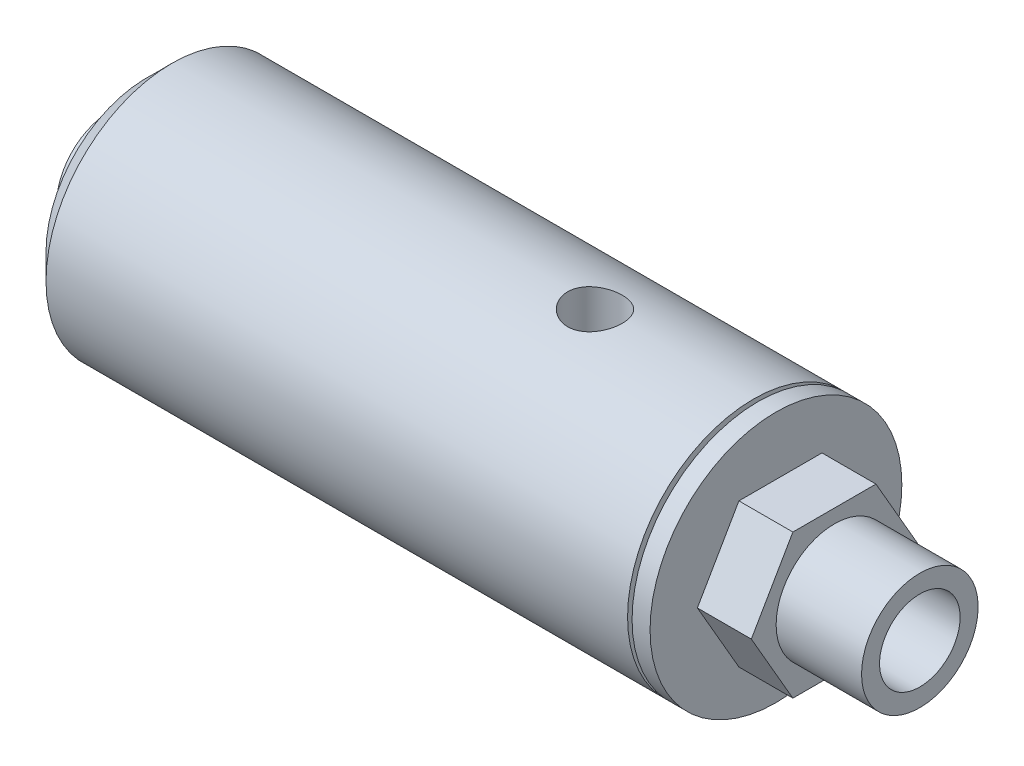
ISO-10303-21;
HEADER;
FILE_DESCRIPTION(('STEP AP214'),'2;1');
FILE_NAME('part.step','',(''),(''),'','','');
FILE_SCHEMA(('AUTOMOTIVE_DESIGN { 1 0 10303 214 1 1 1 1 }'));
ENDSEC;
DATA;
#1=APPLICATION_CONTEXT('core data for automotive mechanical design processes');
#2=APPLICATION_PROTOCOL_DEFINITION('international standard','automotive_design',2000,#1);
#3=PRODUCT_CONTEXT('',#1,'mechanical');
#4=PRODUCT('Part','Part','',(#3));
#5=PRODUCT_RELATED_PRODUCT_CATEGORY('part','',(#4));
#6=PRODUCT_DEFINITION_FORMATION('','',#4);
#7=PRODUCT_DEFINITION_CONTEXT('part definition',#1,'design');
#8=PRODUCT_DEFINITION('design','',#6,#7);
#9=PRODUCT_DEFINITION_SHAPE('','',#8);
#10=(LENGTH_UNIT() NAMED_UNIT(*) SI_UNIT(.MILLI.,.METRE.));
#11=(NAMED_UNIT(*) PLANE_ANGLE_UNIT() SI_UNIT($,.RADIAN.));
#12=(NAMED_UNIT(*) SI_UNIT($,.STERADIAN.) SOLID_ANGLE_UNIT());
#13=UNCERTAINTY_MEASURE_WITH_UNIT(LENGTH_MEASURE(1.E-05),#10,'distance_accuracy_value','');
#14=(GEOMETRIC_REPRESENTATION_CONTEXT(3) GLOBAL_UNCERTAINTY_ASSIGNED_CONTEXT((#13)) GLOBAL_UNIT_ASSIGNED_CONTEXT((#10,
#11,#12)) REPRESENTATION_CONTEXT('',''));
#15=CARTESIAN_POINT('',(0.,0.,0.));
#16=DIRECTION('',(0.,0.,1.));
#17=DIRECTION('',(1.,0.,0.));
#18=AXIS2_PLACEMENT_3D('',#15,#16,#17);
#19=CARTESIAN_POINT('',(55.959375,4.7625,0.));
#20=DIRECTION('',(1.,0.,0.));
#21=DIRECTION('',(0.,0.,-1.));
#22=AXIS2_PLACEMENT_3D('',#19,#20,#21);
#23=PLANE('',#22);
#24=CARTESIAN_POINT('',(55.959375,0.,0.));
#25=DIRECTION('',(-1.,0.,0.));
#26=DIRECTION('',(0.,0.,1.));
#27=AXIS2_PLACEMENT_3D('',#24,#25,#26);
#28=CIRCLE('',#27,4.7625);
#29=CARTESIAN_POINT('',(55.959375,0.,4.7625));
#30=VERTEX_POINT('',#29);
#31=EDGE_CURVE('E151',#30,#30,#28,.T.);
#32=ORIENTED_EDGE('',*,*,#31,.F.);
#33=EDGE_LOOP('',(#32));
#34=FACE_BOUND('',#33,.T.);
#35=DIRECTION('',(0.,-0.866025403784438,0.500000000000001));
#36=VECTOR('',#35,1.);
#37=CARTESIAN_POINT('',(55.959375,6.746875,3.43703832126949));
#38=LINE('',#37,#36);
#39=CARTESIAN_POINT('',(55.959375,6.35,3.66617420935412));
#40=VERTEX_POINT('',#39);
#41=CARTESIAN_POINT('',(55.959375,0.,7.33234841870826));
#42=VERTEX_POINT('',#41);
#43=EDGE_CURVE('E143',#40,#42,#38,.T.);
#44=ORIENTED_EDGE('',*,*,#43,.F.);
#45=DIRECTION('',(0.,0.,1.));
#46=VECTOR('',#45,1.);
#47=CARTESIAN_POINT('',(55.959375,6.35,0.));
#48=LINE('',#47,#46);
#49=CARTESIAN_POINT('',(55.959375,6.35,-3.66617420935413));
#50=VERTEX_POINT('',#49);
#51=EDGE_CURVE('E141',#50,#40,#48,.T.);
#52=ORIENTED_EDGE('',*,*,#51,.F.);
#53=DIRECTION('',(0.,0.866025403784438,0.500000000000001));
#54=VECTOR('',#53,1.);
#55=CARTESIAN_POINT('',(55.959375,6.746875,-3.43703832126949));
#56=LINE('',#55,#54);
#57=CARTESIAN_POINT('',(55.959375,0.,-7.33234841870826));
#58=VERTEX_POINT('',#57);
#59=EDGE_CURVE('E139',#58,#50,#56,.T.);
#60=ORIENTED_EDGE('',*,*,#59,.F.);
#61=DIRECTION('',(0.,0.866025403784438,-0.500000000000001));
#62=VECTOR('',#61,1.);
#63=CARTESIAN_POINT('',(55.959375,0.396874999999985,-7.56148430679289));
#64=LINE('',#63,#62);
#65=CARTESIAN_POINT('',(55.959375,-6.35,-3.66617420935413));
#66=VERTEX_POINT('',#65);
#67=EDGE_CURVE('E137',#66,#58,#64,.T.);
#68=ORIENTED_EDGE('',*,*,#67,.F.);
#69=DIRECTION('',(0.,0.,-1.));
#70=VECTOR('',#69,1.);
#71=CARTESIAN_POINT('',(55.959375,-6.35,0.));
#72=LINE('',#71,#70);
#73=CARTESIAN_POINT('',(55.959375,-6.35,3.66617420935413));
#74=VERTEX_POINT('',#73);
#75=EDGE_CURVE('E99',#74,#66,#72,.T.);
#76=ORIENTED_EDGE('',*,*,#75,.F.);
#77=DIRECTION('',(0.,-0.866025403784438,-0.500000000000001));
#78=VECTOR('',#77,1.);
#79=CARTESIAN_POINT('',(55.959375,0.396874999999988,7.56148430679288));
#80=LINE('',#79,#78);
#81=EDGE_CURVE('E129',#42,#74,#80,.T.);
#82=ORIENTED_EDGE('',*,*,#81,.F.);
#83=EDGE_LOOP('',(#44,#52,#60,#68,#76,#82));
#84=FACE_BOUND('',#83,.T.);
#85=ADVANCED_FACE('F37',(#34,#84),#23,.F.);
#86=CARTESIAN_POINT('',(-3.175,0.,0.));
#87=DIRECTION('',(1.,0.,0.));
#88=DIRECTION('',(0.,0.,-1.));
#89=AXIS2_PLACEMENT_3D('',#86,#87,#88);
#90=PLANE('',#89);
#91=CARTESIAN_POINT('',(-3.175,0.,0.));
#92=DIRECTION('',(-1.,0.,0.));
#93=DIRECTION('',(0.,0.,1.));
#94=AXIS2_PLACEMENT_3D('',#91,#92,#93);
#95=CIRCLE('',#94,4.7625);
#96=CARTESIAN_POINT('',(-3.175,0.,4.7625));
#97=VERTEX_POINT('',#96);
#98=EDGE_CURVE('E51',#97,#97,#95,.T.);
#99=ORIENTED_EDGE('',*,*,#98,.T.);
#100=EDGE_LOOP('',(#99));
#101=FACE_BOUND('',#100,.T.);
#102=ADVANCED_FACE('F39',(#101),#90,.F.);
#103=CARTESIAN_POINT('',(0.,0.,0.));
#104=DIRECTION('',(-1.,0.,0.));
#105=DIRECTION('',(0.,0.,1.));
#106=AXIS2_PLACEMENT_3D('',#103,#104,#105);
#107=CYLINDRICAL_SURFACE('',#106,4.7625);
#108=ORIENTED_EDGE('',*,*,#98,.F.);
#109=EDGE_LOOP('',(#108));
#110=FACE_BOUND('',#109,.T.);
#111=CARTESIAN_POINT('',(0.,0.,0.));
#112=DIRECTION('',(-1.,0.,0.));
#113=DIRECTION('',(0.,0.,1.));
#114=AXIS2_PLACEMENT_3D('',#111,#112,#113);
#115=CIRCLE('',#114,4.7625);
#116=CARTESIAN_POINT('',(0.,0.,4.7625));
#117=VERTEX_POINT('',#116);
#118=EDGE_CURVE('E178',#117,#117,#115,.T.);
#119=ORIENTED_EDGE('',*,*,#118,.T.);
#120=EDGE_LOOP('',(#119));
#121=FACE_BOUND('',#120,.T.);
#122=ADVANCED_FACE('F308',(#110,#121),#107,.T.);
#123=CARTESIAN_POINT('',(0.,4.7625,0.));
#124=DIRECTION('',(1.,0.,0.));
#125=DIRECTION('',(0.,0.,-1.));
#126=AXIS2_PLACEMENT_3D('',#123,#124,#125);
#127=PLANE('',#126);
#128=ORIENTED_EDGE('',*,*,#118,.F.);
#129=EDGE_LOOP('',(#128));
#130=FACE_BOUND('',#129,.T.);
#131=CARTESIAN_POINT('',(0.,0.,0.));
#132=DIRECTION('',(-1.,0.,0.));
#133=DIRECTION('',(0.,0.,1.));
#134=AXIS2_PLACEMENT_3D('',#131,#132,#133);
#135=CIRCLE('',#134,8.86743596973272);
#136=CARTESIAN_POINT('',(0.,0.,8.86743596973272));
#137=VERTEX_POINT('',#136);
#138=EDGE_CURVE('E175',#137,#137,#135,.T.);
#139=ORIENTED_EDGE('',*,*,#138,.T.);
#140=EDGE_LOOP('',(#139));
#141=FACE_BOUND('',#140,.T.);
#142=ADVANCED_FACE('F303',(#130,#141),#127,.F.);
#143=CARTESIAN_POINT('',(2.2450640302673,0.,0.));
#144=DIRECTION('',(1.,0.,0.));
#145=DIRECTION('',(0.,0.,-1.));
#146=AXIS2_PLACEMENT_3D('',#143,#144,#145);
#147=CONICAL_SURFACE('',#146,11.1125,0.785398163397443);
#148=ORIENTED_EDGE('',*,*,#138,.F.);
#149=EDGE_LOOP('',(#148));
#150=FACE_BOUND('',#149,.T.);
#151=CARTESIAN_POINT('',(2.2450640302673,0.,0.));
#152=DIRECTION('',(-1.,0.,0.));
#153=DIRECTION('',(0.,0.,1.));
#154=AXIS2_PLACEMENT_3D('',#151,#152,#153);
#155=CIRCLE('',#154,11.1125);
#156=CARTESIAN_POINT('',(2.2450640302673,0.,11.1125));
#157=VERTEX_POINT('',#156);
#158=EDGE_CURVE('E172',#157,#157,#155,.T.);
#159=ORIENTED_EDGE('',*,*,#158,.T.);
#160=EDGE_LOOP('',(#159));
#161=FACE_BOUND('',#160,.T.);
#162=ADVANCED_FACE('F257',(#150,#161),#147,.T.);
#163=CARTESIAN_POINT('',(0.,0.,0.));
#164=DIRECTION('',(-1.,0.,0.));
#165=DIRECTION('',(0.,0.,1.));
#166=AXIS2_PLACEMENT_3D('',#163,#164,#165);
#167=CYLINDRICAL_SURFACE('',#166,11.1125);
#168=CARTESIAN_POINT('',(39.5903119366338,10.8473539284933,2.413));
#169=CARTESIAN_POINT('',(39.4564983475278,10.8473566325932,2.41299536523069));
#170=CARTESIAN_POINT('',(39.3226288222653,10.8498569914679,2.40183114257628));
#171=CARTESIAN_POINT('',(39.0586950262547,10.8595702112552,2.35751707981081));
#172=CARTESIAN_POINT('',(38.928633604705,10.8667865109898,2.32435119601878));
#173=CARTESIAN_POINT('',(38.676172152366,10.8850766676299,2.23712589919764));
#174=CARTESIAN_POINT('',(38.5537639523512,10.8961463254847,2.1830892223309));
#175=CARTESIAN_POINT('',(38.3197484485992,10.920890878255,2.05572106524507));
#176=CARTESIAN_POINT('',(38.2081408893158,10.9345657115087,1.98239004168842));
#177=CARTESIAN_POINT('',(37.9970343535966,10.9632341920835,1.81721327502807));
#178=CARTESIAN_POINT('',(37.8977413994891,10.9782445025227,1.7251070690007));
#179=CARTESIAN_POINT('',(37.7158864864116,11.0077467050061,1.52555680571479));
#180=CARTESIAN_POINT('',(37.6333258163532,11.0222385570419,1.41811156795459));
#181=CARTESIAN_POINT('',(37.4864654793526,11.0492523151206,1.18955341293176));
#182=CARTESIAN_POINT('',(37.4223637588151,11.0617522683478,1.06831048716345));
#183=CARTESIAN_POINT('',(37.3155212900612,11.083185692043,0.816456803370163));
#184=CARTESIAN_POINT('',(37.2727781800421,11.0921195568216,0.685847082938404));
#185=CARTESIAN_POINT('',(37.2105136411528,11.105296450146,0.421109140139869));
#186=CARTESIAN_POINT('',(37.1906435985744,11.1096098279658,0.28706646985195));
#187=CARTESIAN_POINT('',(37.1735994642124,11.1133034174383,0.0174854787151917));
#188=CARTESIAN_POINT('',(37.1764228119184,11.1126841856407,-0.118052671674361));
#189=CARTESIAN_POINT('',(37.2044252547053,11.1066361565628,-0.384374628633498));
#190=CARTESIAN_POINT('',(37.2292286098751,11.1012881984522,-0.515200048132801));
#191=CARTESIAN_POINT('',(37.2998884823152,11.0864756441973,-0.770786213785542));
#192=CARTESIAN_POINT('',(37.3457459424283,11.077010863695,-0.895546688062449));
#193=CARTESIAN_POINT('',(37.4575460334238,11.0548978559292,-1.13650705266897));
#194=CARTESIAN_POINT('',(37.5236315089853,11.0422271030192,-1.25263851451127));
#195=CARTESIAN_POINT('',(37.6739052609323,11.0150921330181,-1.47230059095359));
#196=CARTESIAN_POINT('',(37.7580959701722,11.000627675012,-1.57582950918133));
#197=CARTESIAN_POINT('',(37.9442373235921,10.9711463010903,-1.76958197311889));
#198=CARTESIAN_POINT('',(38.0465168191376,10.9561241389142,-1.85948906193717));
#199=CARTESIAN_POINT('',(38.2648564624521,10.927498686554,-2.02093321433105));
#200=CARTESIAN_POINT('',(38.38091697283,10.9138954337223,-2.09246979438138));
#201=CARTESIAN_POINT('',(38.6240307327434,10.8896344593573,-2.21528012241566));
#202=CARTESIAN_POINT('',(38.7511147297143,10.8789853487232,-2.26649481795428));
#203=CARTESIAN_POINT('',(39.0123710462003,10.8619582698785,-2.3467465170647));
#204=CARTESIAN_POINT('',(39.1465422557153,10.8555796349529,-2.37578698262029));
#205=CARTESIAN_POINT('',(39.4152748240102,10.8479514911862,-2.41037658049926));
#206=CARTESIAN_POINT('',(39.5497741316899,10.8466014617616,-2.41638616597739));
#207=CARTESIAN_POINT('',(39.8178528378366,10.8489123423339,-2.40598937334911));
#208=CARTESIAN_POINT('',(39.9514322979014,10.8525729134502,-2.38958451119392));
#209=CARTESIAN_POINT('',(40.2122810726261,10.8643976870918,-2.33522377750973));
#210=CARTESIAN_POINT('',(40.3396057195984,10.8725089988327,-2.29752085119663));
#211=CARTESIAN_POINT('',(40.5861306618844,10.8922737174033,-2.20190781636609));
#212=CARTESIAN_POINT('',(40.7053301875489,10.9039274592191,-2.14399579672029));
#213=CARTESIAN_POINT('',(40.9342158162456,10.9296852412302,-2.00859158826822));
#214=CARTESIAN_POINT('',(41.0437299224139,10.9438238100197,-1.93081536033275));
#215=CARTESIAN_POINT('',(41.2483210232244,10.9728668030104,-1.7582627866195));
#216=CARTESIAN_POINT('',(41.3433962495188,10.9877713207197,-1.66348436165656));
#217=CARTESIAN_POINT('',(41.5181943610172,11.0169977539103,-1.45753562777102));
#218=CARTESIAN_POINT('',(41.5976035478131,11.0313039618139,-1.34609646306576));
#219=CARTESIAN_POINT('',(41.7365737373262,11.0574342310236,-1.1111927049055));
#220=CARTESIAN_POINT('',(41.7961356597085,11.0692584073306,-0.987728668991153));
#221=CARTESIAN_POINT('',(41.8932819150776,11.0890260413229,-0.733043294905274));
#222=CARTESIAN_POINT('',(41.9310043063545,11.0969938234047,-0.601876590746044));
#223=CARTESIAN_POINT('',(41.9838324271872,11.1082560155652,-0.334875561807214));
#224=CARTESIAN_POINT('',(41.9989413945885,11.1115510946895,-0.199041908102508));
#225=CARTESIAN_POINT('',(42.005969962632,11.1130771043289,0.0704576168273382));
#226=CARTESIAN_POINT('',(41.9983582075799,11.111410380361,0.20411090195856));
#227=CARTESIAN_POINT('',(41.9612084755566,11.1034189770872,0.46818488118037));
#228=CARTESIAN_POINT('',(41.9316708817072,11.0970943791708,0.598605631713601));
#229=CARTESIAN_POINT('',(41.8517311374002,11.0805050304019,0.852156061841602));
#230=CARTESIAN_POINT('',(41.8013945708959,11.0702526720181,0.975307281236435));
#231=CARTESIAN_POINT('',(41.6813500423314,11.0469033808833,1.2114787484616));
#232=CARTESIAN_POINT('',(41.6116402293231,11.0338061763577,1.3244980269063));
#233=CARTESIAN_POINT('',(41.4532952654538,11.0058903790595,1.53948614953628));
#234=CARTESIAN_POINT('',(41.3643300424175,10.9910441351512,1.64120831828216));
#235=CARTESIAN_POINT('',(41.1706665478428,10.9614537941107,1.82844003227747));
#236=CARTESIAN_POINT('',(41.065964496031,10.9467097224147,1.91394567082729));
#237=CARTESIAN_POINT('',(40.842145828231,10.9187774583715,2.06739792618529));
#238=CARTESIAN_POINT('',(40.7228579386227,10.9056122466643,2.13509914906775));
#239=CARTESIAN_POINT('',(40.4743381417198,10.8826165104763,2.24938629142925));
#240=CARTESIAN_POINT('',(40.3451148142766,10.8727831475582,2.29599019537115));
#241=CARTESIAN_POINT('',(40.1115062786641,10.8593953318011,2.35837610462059));
#242=CARTESIAN_POINT('',(40.0083943208093,10.8549095982376,2.37882101694677));
#243=CARTESIAN_POINT('',(39.8003036448371,10.8488879053539,2.40613446190443));
#244=CARTESIAN_POINT('',(39.6953250153284,10.8473518063931,2.41300363723444));
#245=CARTESIAN_POINT('',(39.5903119366338,10.8473539284933,2.413));
#246=B_SPLINE_CURVE_WITH_KNOTS('',3,(#168,#169,#170,#171,#172,#173,#174,#175,#176,#177,#178,
#179,#180,#181,#182,#183,#184,#185,#186,#187,#188,#189,#190,#191,#192,#193,#194,#195,#196,#197,
#198,#199,#200,#201,#202,#203,#204,#205,#206,#207,#208,#209,#210,#211,#212,#213,#214,#215,#216,
#217,#218,#219,#220,#221,#222,#223,#224,#225,#226,#227,#228,#229,#230,#231,#232,#233,#234,#235,
#236,#237,#238,#239,#240,#241,#242,#243,#244,#245),.UNSPECIFIED.,.T.,.F.,(4,2,2,2,2,2,2,2,2,2,2,
2,2,2,2,2,2,2,2,2,2,2,2,2,2,2,2,2,2,2,2,2,2,2,2,2,2,2,4),(0.,0.401055934528801,
0.802404642256301,1.20331735752686,1.6042205847688,2.01111872841688,2.41804820410424,
2.82919145621259,3.24028923465722,3.64503477115151,4.04973464058112,4.4476469719788,
4.84557712438702,5.24638484443852,5.64724645591471,6.05633004087489,6.46542439211189,
6.87569895601273,7.28590945209798,7.68787453354507,8.08981243032545,8.48707417473379,
8.88437349747422,9.28770732324977,9.69109050606325,10.1018751061907,10.5126406690929,
10.9207804036163,11.328861694101,11.7285843364527,12.1282999944028,12.5267647604482,
12.9252676094921,13.3312357774791,13.7373016227519,14.1487012257154,14.5597494665916,
14.8745015981653,15.1892388284795),.UNSPECIFIED.);
#247=CARTESIAN_POINT('',(39.5903119366338,10.8473539284933,2.413));
#248=VERTEX_POINT('',#247);
#249=EDGE_CURVE('E11',#248,#248,#246,.T.);
#250=ORIENTED_EDGE('',*,*,#249,.T.);
#251=EDGE_LOOP('',(#250));
#252=FACE_BOUND('',#251,.T.);
#253=ORIENTED_EDGE('',*,*,#158,.F.);
#254=EDGE_LOOP('',(#253));
#255=FACE_BOUND('',#254,.T.);
#256=CARTESIAN_POINT('',(53.578125,0.,0.));
#257=DIRECTION('',(-1.,0.,0.));
#258=DIRECTION('',(0.,0.,1.));
#259=AXIS2_PLACEMENT_3D('',#256,#257,#258);
#260=CIRCLE('',#259,11.1125);
#261=CARTESIAN_POINT('',(53.578125,0.,11.1125));
#262=VERTEX_POINT('',#261);
#263=EDGE_CURVE('E169',#262,#262,#260,.T.);
#264=ORIENTED_EDGE('',*,*,#263,.T.);
#265=EDGE_LOOP('',(#264));
#266=FACE_BOUND('',#265,.T.);
#267=ADVANCED_FACE('F186',(#252,#255,#266),#167,.T.);
#268=CARTESIAN_POINT('',(53.578125,11.1125,0.));
#269=DIRECTION('',(-1.,0.,0.));
#270=DIRECTION('',(0.,0.,1.));
#271=AXIS2_PLACEMENT_3D('',#268,#269,#270);
#272=PLANE('',#271);
#273=ORIENTED_EDGE('',*,*,#263,.F.);
#274=EDGE_LOOP('',(#273));
#275=FACE_BOUND('',#274,.T.);
#276=CARTESIAN_POINT('',(53.578125,0.,0.));
#277=DIRECTION('',(-1.,0.,0.));
#278=DIRECTION('',(0.,0.,1.));
#279=AXIS2_PLACEMENT_3D('',#276,#277,#278);
#280=CIRCLE('',#279,10.004904013942);
#281=CARTESIAN_POINT('',(53.578125,0.,10.004904013942));
#282=VERTEX_POINT('',#281);
#283=EDGE_CURVE('E166',#282,#282,#280,.T.);
#284=ORIENTED_EDGE('',*,*,#283,.T.);
#285=EDGE_LOOP('',(#284));
#286=FACE_BOUND('',#285,.T.);
#287=ADVANCED_FACE('F250',(#275,#286),#272,.F.);
#288=CARTESIAN_POINT('',(0.,0.,0.));
#289=DIRECTION('',(-1.,0.,0.));
#290=DIRECTION('',(0.,0.,1.));
#291=AXIS2_PLACEMENT_3D('',#288,#289,#290);
#292=CYLINDRICAL_SURFACE('',#291,10.004904013942);
#293=ORIENTED_EDGE('',*,*,#283,.F.);
#294=EDGE_LOOP('',(#293));
#295=FACE_BOUND('',#294,.T.);
#296=CARTESIAN_POINT('',(53.975,0.,0.));
#297=DIRECTION('',(-1.,0.,0.));
#298=DIRECTION('',(0.,0.,1.));
#299=AXIS2_PLACEMENT_3D('',#296,#297,#298);
#300=CIRCLE('',#299,10.004904013942);
#301=CARTESIAN_POINT('',(53.975,0.,10.004904013942));
#302=VERTEX_POINT('',#301);
#303=EDGE_CURVE('E163',#302,#302,#300,.T.);
#304=ORIENTED_EDGE('',*,*,#303,.T.);
#305=EDGE_LOOP('',(#304));
#306=FACE_BOUND('',#305,.T.);
#307=ADVANCED_FACE('F247',(#295,#306),#292,.T.);
#308=CARTESIAN_POINT('',(53.975,11.1125,0.));
#309=DIRECTION('',(1.,0.,0.));
#310=DIRECTION('',(0.,0.,-1.));
#311=AXIS2_PLACEMENT_3D('',#308,#309,#310);
#312=PLANE('',#311);
#313=ORIENTED_EDGE('',*,*,#303,.F.);
#314=EDGE_LOOP('',(#313));
#315=FACE_BOUND('',#314,.T.);
#316=CARTESIAN_POINT('',(53.975,0.,0.));
#317=DIRECTION('',(-1.,0.,0.));
#318=DIRECTION('',(0.,0.,1.));
#319=AXIS2_PLACEMENT_3D('',#316,#317,#318);
#320=CIRCLE('',#319,11.1125);
#321=CARTESIAN_POINT('',(53.975,0.,11.1125));
#322=VERTEX_POINT('',#321);
#323=EDGE_CURVE('E160',#322,#322,#320,.T.);
#324=ORIENTED_EDGE('',*,*,#323,.T.);
#325=EDGE_LOOP('',(#324));
#326=FACE_BOUND('',#325,.T.);
#327=ADVANCED_FACE('F243',(#315,#326),#312,.F.);
#328=CARTESIAN_POINT('',(0.,0.,0.));
#329=DIRECTION('',(-1.,0.,0.));
#330=DIRECTION('',(0.,0.,1.));
#331=AXIS2_PLACEMENT_3D('',#328,#329,#330);
#332=CYLINDRICAL_SURFACE('',#331,11.1125);
#333=ORIENTED_EDGE('',*,*,#323,.F.);
#334=EDGE_LOOP('',(#333));
#335=FACE_BOUND('',#334,.T.);
#336=CARTESIAN_POINT('',(55.5625,0.,0.));
#337=DIRECTION('',(-1.,0.,0.));
#338=DIRECTION('',(0.,0.,1.));
#339=AXIS2_PLACEMENT_3D('',#336,#337,#338);
#340=CIRCLE('',#339,11.1125);
#341=CARTESIAN_POINT('',(55.5625,0.,11.1125));
#342=VERTEX_POINT('',#341);
#343=EDGE_CURVE('E157',#342,#342,#340,.T.);
#344=ORIENTED_EDGE('',*,*,#343,.T.);
#345=EDGE_LOOP('',(#344));
#346=FACE_BOUND('',#345,.T.);
#347=ADVANCED_FACE('F239',(#335,#346),#332,.T.);
#348=CARTESIAN_POINT('',(55.5625,4.7625,0.));
#349=DIRECTION('',(-1.,0.,0.));
#350=DIRECTION('',(0.,0.,1.));
#351=AXIS2_PLACEMENT_3D('',#348,#349,#350);
#352=PLANE('',#351);
#353=ORIENTED_EDGE('',*,*,#343,.F.);
#354=EDGE_LOOP('',(#353));
#355=FACE_BOUND('',#354,.T.);
#356=CARTESIAN_POINT('',(55.5625,0.,0.));
#357=DIRECTION('',(-1.,0.,0.));
#358=DIRECTION('',(0.,0.,1.));
#359=AXIS2_PLACEMENT_3D('',#356,#357,#358);
#360=CIRCLE('',#359,4.7625);
#361=CARTESIAN_POINT('',(55.5625,0.,4.7625));
#362=VERTEX_POINT('',#361);
#363=EDGE_CURVE('E154',#362,#362,#360,.T.);
#364=ORIENTED_EDGE('',*,*,#363,.T.);
#365=EDGE_LOOP('',(#364));
#366=FACE_BOUND('',#365,.T.);
#367=ADVANCED_FACE('F235',(#355,#366),#352,.F.);
#368=CARTESIAN_POINT('',(0.,0.,0.));
#369=DIRECTION('',(-1.,0.,0.));
#370=DIRECTION('',(0.,0.,1.));
#371=AXIS2_PLACEMENT_3D('',#368,#369,#370);
#372=CYLINDRICAL_SURFACE('',#371,4.7625);
#373=ORIENTED_EDGE('',*,*,#363,.F.);
#374=EDGE_LOOP('',(#373));
#375=FACE_BOUND('',#374,.T.);
#376=ORIENTED_EDGE('',*,*,#31,.T.);
#377=EDGE_LOOP('',(#376));
#378=FACE_BOUND('',#377,.T.);
#379=ADVANCED_FACE('F218',(#375,#378),#372,.T.);
#380=CARTESIAN_POINT('',(55.705375,0.,7.33234841870826));
#381=DIRECTION('',(0.,0.500000000000001,0.866025403784438));
#382=DIRECTION('',(0.,-0.866025403784438,0.500000000000001));
#383=AXIS2_PLACEMENT_3D('',#380,#381,#382);
#384=PLANE('',#383);
#385=ORIENTED_EDGE('',*,*,#43,.T.);
#386=DIRECTION('',(1.,0.,0.));
#387=VECTOR('',#386,1.);
#388=CARTESIAN_POINT('',(55.705375,0.,7.33234841870826));
#389=LINE('',#388,#387);
#390=CARTESIAN_POINT('',(60.721875,0.,7.33234841870826));
#391=VERTEX_POINT('',#390);
#392=EDGE_CURVE('E58',#42,#391,#389,.T.);
#393=ORIENTED_EDGE('',*,*,#392,.T.);
#394=DIRECTION('',(0.,-0.866025403784438,0.500000000000001));
#395=VECTOR('',#394,1.);
#396=CARTESIAN_POINT('',(60.721875,0.,7.33234841870826));
#397=LINE('',#396,#395);
#398=CARTESIAN_POINT('',(60.721875,6.35,3.66617420935412));
#399=VERTEX_POINT('',#398);
#400=EDGE_CURVE('E119',#399,#391,#397,.T.);
#401=ORIENTED_EDGE('',*,*,#400,.F.);
#402=DIRECTION('',(1.,0.,0.));
#403=VECTOR('',#402,1.);
#404=CARTESIAN_POINT('',(55.705375,6.35,3.66617420935412));
#405=LINE('',#404,#403);
#406=EDGE_CURVE('E127',#40,#399,#405,.T.);
#407=ORIENTED_EDGE('',*,*,#406,.F.);
#408=EDGE_LOOP('',(#385,#393,#401,#407));
#409=FACE_BOUND('',#408,.T.);
#410=ADVANCED_FACE('F203',(#409),#384,.T.);
#411=CARTESIAN_POINT('',(55.705375,6.35,3.66617420935412));
#412=DIRECTION('',(0.,1.,0.));
#413=DIRECTION('',(0.,0.,1.));
#414=AXIS2_PLACEMENT_3D('',#411,#412,#413);
#415=PLANE('',#414);
#416=ORIENTED_EDGE('',*,*,#51,.T.);
#417=ORIENTED_EDGE('',*,*,#406,.T.);
#418=DIRECTION('',(0.,0.,1.));
#419=VECTOR('',#418,1.);
#420=CARTESIAN_POINT('',(60.721875,6.35,3.66617420935412));
#421=LINE('',#420,#419);
#422=CARTESIAN_POINT('',(60.721875,6.35,-3.66617420935413));
#423=VERTEX_POINT('',#422);
#424=EDGE_CURVE('E124',#423,#399,#421,.T.);
#425=ORIENTED_EDGE('',*,*,#424,.F.);
#426=DIRECTION('',(1.,0.,0.));
#427=VECTOR('',#426,1.);
#428=CARTESIAN_POINT('',(55.705375,6.35,-3.66617420935413));
#429=LINE('',#428,#427);
#430=EDGE_CURVE('E130',#50,#423,#429,.T.);
#431=ORIENTED_EDGE('',*,*,#430,.F.);
#432=EDGE_LOOP('',(#416,#417,#425,#431));
#433=FACE_BOUND('',#432,.T.);
#434=ADVANCED_FACE('F198',(#433),#415,.T.);
#435=CARTESIAN_POINT('',(55.705375,6.35,-3.66617420935413));
#436=DIRECTION('',(0.,0.500000000000001,-0.866025403784438));
#437=DIRECTION('',(0.,0.866025403784438,0.500000000000001));
#438=AXIS2_PLACEMENT_3D('',#435,#436,#437);
#439=PLANE('',#438);
#440=ORIENTED_EDGE('',*,*,#59,.T.);
#441=ORIENTED_EDGE('',*,*,#430,.T.);
#442=DIRECTION('',(0.,0.866025403784438,0.500000000000001));
#443=VECTOR('',#442,1.);
#444=CARTESIAN_POINT('',(60.721875,6.35,-3.66617420935413));
#445=LINE('',#444,#443);
#446=CARTESIAN_POINT('',(60.721875,0.,-7.33234841870826));
#447=VERTEX_POINT('',#446);
#448=EDGE_CURVE('E112',#447,#423,#445,.T.);
#449=ORIENTED_EDGE('',*,*,#448,.F.);
#450=DIRECTION('',(1.,0.,0.));
#451=VECTOR('',#450,1.);
#452=CARTESIAN_POINT('',(55.705375,0.,-7.33234841870826));
#453=LINE('',#452,#451);
#454=EDGE_CURVE('E102',#58,#447,#453,.T.);
#455=ORIENTED_EDGE('',*,*,#454,.F.);
#456=EDGE_LOOP('',(#440,#441,#449,#455));
#457=FACE_BOUND('',#456,.T.);
#458=ADVANCED_FACE('F202',(#457),#439,.T.);
#459=CARTESIAN_POINT('',(55.705375,0.,-7.33234841870826));
#460=DIRECTION('',(0.,-0.500000000000001,-0.866025403784438));
#461=DIRECTION('',(0.,0.866025403784438,-0.500000000000001));
#462=AXIS2_PLACEMENT_3D('',#459,#460,#461);
#463=PLANE('',#462);
#464=ORIENTED_EDGE('',*,*,#67,.T.);
#465=ORIENTED_EDGE('',*,*,#454,.T.);
#466=DIRECTION('',(0.,0.866025403784438,-0.500000000000001));
#467=VECTOR('',#466,1.);
#468=CARTESIAN_POINT('',(60.721875,0.,-7.33234841870826));
#469=LINE('',#468,#467);
#470=CARTESIAN_POINT('',(60.721875,-6.35,-3.66617420935413));
#471=VERTEX_POINT('',#470);
#472=EDGE_CURVE('E106',#471,#447,#469,.T.);
#473=ORIENTED_EDGE('',*,*,#472,.F.);
#474=DIRECTION('',(1.,0.,0.));
#475=VECTOR('',#474,1.);
#476=CARTESIAN_POINT('',(55.705375,-6.35,-3.66617420935413));
#477=LINE('',#476,#475);
#478=EDGE_CURVE('E95',#66,#471,#477,.T.);
#479=ORIENTED_EDGE('',*,*,#478,.F.);
#480=EDGE_LOOP('',(#464,#465,#473,#479));
#481=FACE_BOUND('',#480,.T.);
#482=ADVANCED_FACE('F107',(#481),#463,.T.);
#483=CARTESIAN_POINT('',(55.705375,-6.35,-3.66617420935413));
#484=DIRECTION('',(0.,-1.,0.));
#485=DIRECTION('',(0.,0.,-1.));
#486=AXIS2_PLACEMENT_3D('',#483,#484,#485);
#487=PLANE('',#486);
#488=ORIENTED_EDGE('',*,*,#75,.T.);
#489=ORIENTED_EDGE('',*,*,#478,.T.);
#490=DIRECTION('',(0.,0.,-1.));
#491=VECTOR('',#490,1.);
#492=CARTESIAN_POINT('',(60.721875,-6.35,-3.66617420935413));
#493=LINE('',#492,#491);
#494=CARTESIAN_POINT('',(60.721875,-6.35,3.66617420935413));
#495=VERTEX_POINT('',#494);
#496=EDGE_CURVE('E66',#495,#471,#493,.T.);
#497=ORIENTED_EDGE('',*,*,#496,.F.);
#498=DIRECTION('',(1.,0.,0.));
#499=VECTOR('',#498,1.);
#500=CARTESIAN_POINT('',(55.705375,-6.35,3.66617420935413));
#501=LINE('',#500,#499);
#502=EDGE_CURVE('E103',#74,#495,#501,.T.);
#503=ORIENTED_EDGE('',*,*,#502,.F.);
#504=EDGE_LOOP('',(#488,#489,#497,#503));
#505=FACE_BOUND('',#504,.T.);
#506=ADVANCED_FACE('F97',(#505),#487,.T.);
#507=CARTESIAN_POINT('',(55.705375,-6.35,3.66617420935413));
#508=DIRECTION('',(0.,-0.500000000000001,0.866025403784438));
#509=DIRECTION('',(0.,-0.866025403784438,-0.500000000000001));
#510=AXIS2_PLACEMENT_3D('',#507,#508,#509);
#511=PLANE('',#510);
#512=ORIENTED_EDGE('',*,*,#81,.T.);
#513=ORIENTED_EDGE('',*,*,#502,.T.);
#514=DIRECTION('',(0.,-0.866025403784438,-0.500000000000001));
#515=VECTOR('',#514,1.);
#516=CARTESIAN_POINT('',(60.721875,-6.35,3.66617420935413));
#517=LINE('',#516,#515);
#518=EDGE_CURVE('E117',#391,#495,#517,.T.);
#519=ORIENTED_EDGE('',*,*,#518,.F.);
#520=ORIENTED_EDGE('',*,*,#392,.F.);
#521=EDGE_LOOP('',(#512,#513,#519,#520));
#522=FACE_BOUND('',#521,.T.);
#523=ADVANCED_FACE('F212',(#522),#511,.T.);
#524=CARTESIAN_POINT('',(68.2625,0.,0.));
#525=DIRECTION('',(-1.,0.,0.));
#526=DIRECTION('',(0.,0.,1.));
#527=AXIS2_PLACEMENT_3D('',#524,#525,#526);
#528=PLANE('',#527);
#529=CARTESIAN_POINT('',(68.2625,0.,0.));
#530=DIRECTION('',(1.,0.,0.));
#531=DIRECTION('',(0.,0.,-1.));
#532=AXIS2_PLACEMENT_3D('',#529,#530,#531);
#533=CIRCLE('',#532,3.556);
#534=CARTESIAN_POINT('',(68.2625,0.,-3.556));
#535=VERTEX_POINT('',#534);
#536=EDGE_CURVE('E284',#535,#535,#533,.T.);
#537=ORIENTED_EDGE('',*,*,#536,.F.);
#538=EDGE_LOOP('',(#537));
#539=FACE_BOUND('',#538,.T.);
#540=CARTESIAN_POINT('',(68.2625,0.,0.));
#541=DIRECTION('',(-1.,0.,0.));
#542=DIRECTION('',(0.,0.,1.));
#543=AXIS2_PLACEMENT_3D('',#540,#541,#542);
#544=CIRCLE('',#543,5.1435);
#545=CARTESIAN_POINT('',(68.2625,0.,5.1435));
#546=VERTEX_POINT('',#545);
#547=EDGE_CURVE('E145',#546,#546,#544,.T.);
#548=ORIENTED_EDGE('',*,*,#547,.F.);
#549=EDGE_LOOP('',(#548));
#550=FACE_BOUND('',#549,.T.);
#551=ADVANCED_FACE('F215',(#539,#550),#528,.F.);
#552=CARTESIAN_POINT('',(0.,0.,0.));
#553=DIRECTION('',(-1.,0.,0.));
#554=DIRECTION('',(0.,0.,1.));
#555=AXIS2_PLACEMENT_3D('',#552,#553,#554);
#556=CYLINDRICAL_SURFACE('',#555,5.1435);
#557=CARTESIAN_POINT('',(60.721875,0.,0.));
#558=DIRECTION('',(-1.,0.,0.));
#559=DIRECTION('',(0.,0.,1.));
#560=AXIS2_PLACEMENT_3D('',#557,#558,#559);
#561=CIRCLE('',#560,5.1435);
#562=CARTESIAN_POINT('',(60.721875,0.,5.1435));
#563=VERTEX_POINT('',#562);
#564=EDGE_CURVE('E148',#563,#563,#561,.T.);
#565=ORIENTED_EDGE('',*,*,#564,.F.);
#566=EDGE_LOOP('',(#565));
#567=FACE_BOUND('',#566,.T.);
#568=ORIENTED_EDGE('',*,*,#547,.T.);
#569=EDGE_LOOP('',(#568));
#570=FACE_BOUND('',#569,.T.);
#571=ADVANCED_FACE('F222',(#567,#570),#556,.T.);
#572=CARTESIAN_POINT('',(60.721875,5.1435,0.));
#573=DIRECTION('',(-1.,0.,0.));
#574=DIRECTION('',(0.,0.,1.));
#575=AXIS2_PLACEMENT_3D('',#572,#573,#574);
#576=PLANE('',#575);
#577=ORIENTED_EDGE('',*,*,#564,.T.);
#578=EDGE_LOOP('',(#577));
#579=FACE_BOUND('',#578,.T.);
#580=ORIENTED_EDGE('',*,*,#400,.T.);
#581=ORIENTED_EDGE('',*,*,#518,.T.);
#582=ORIENTED_EDGE('',*,*,#496,.T.);
#583=ORIENTED_EDGE('',*,*,#472,.T.);
#584=ORIENTED_EDGE('',*,*,#448,.T.);
#585=ORIENTED_EDGE('',*,*,#424,.T.);
#586=EDGE_LOOP('',(#580,#581,#582,#583,#584,#585));
#587=FACE_BOUND('',#586,.T.);
#588=ADVANCED_FACE('F116',(#579,#587),#576,.F.);
#589=CARTESIAN_POINT('',(39.5903119366338,-0.444500000000007,0.));
#590=DIRECTION('',(0.,1.,0.));
#591=DIRECTION('',(0.,0.,1.));
#592=AXIS2_PLACEMENT_3D('',#589,#590,#591);
#593=CYLINDRICAL_SURFACE('',#592,2.413);
#594=CARTESIAN_POINT('',(39.5903119366338,2.6120044027528,2.413));
#595=CARTESIAN_POINT('',(39.4731971237496,2.61201129294419,2.4129962306447));
#596=CARTESIAN_POINT('',(39.3560614069411,2.62002860522744,2.40439996363171));
#597=CARTESIAN_POINT('',(39.1260347663638,2.65047503283889,2.37077911734232));
#598=CARTESIAN_POINT('',(39.0131521351451,2.67293090177739,2.34572403919785));
#599=CARTESIAN_POINT('',(38.7957176968434,2.72817796328574,2.28121530297064));
#600=CARTESIAN_POINT('',(38.6910938417479,2.76086350724569,2.2419082049798));
#601=CARTESIAN_POINT('',(38.4901181074795,2.83269672192394,2.15042920943161));
#602=CARTESIAN_POINT('',(38.3937675830648,2.87184544793258,2.09825521031444));
#603=CARTESIAN_POINT('',(38.1949416117323,2.95980156725925,1.97268655185286));
#604=CARTESIAN_POINT('',(38.0940105558005,3.00914527749377,1.89722202994682));
#605=CARTESIAN_POINT('',(37.9048804124822,3.10752802605406,1.73139364820219));
#606=CARTESIAN_POINT('',(37.8166958734537,3.15656665605428,1.64101301170329));
#607=CARTESIAN_POINT('',(37.6422075642636,3.25758715974314,1.43135469808373));
#608=CARTESIAN_POINT('',(37.5582346352994,3.30888026896608,1.30977245757777));
#609=CARTESIAN_POINT('',(37.4127227155181,3.40018525562148,1.05009706477577));
#610=CARTESIAN_POINT('',(37.3511419614257,3.44021810245858,0.912035293932925));
#611=CARTESIAN_POINT('',(37.266682138862,3.49586954135765,0.660425365035708));
#612=CARTESIAN_POINT('',(37.2379335298492,3.51511331414756,0.549634764479675));
#613=CARTESIAN_POINT('',(37.1963919582767,3.54304624569274,0.323822552507764));
#614=CARTESIAN_POINT('',(37.1835867634149,3.55174349594697,0.208804254561315));
#615=CARTESIAN_POINT('',(37.1746392911141,3.55781265922396,-0.0223764570763306));
#616=CARTESIAN_POINT('',(37.1785251353866,3.55516545869238,-0.138540472417311));
#617=CARTESIAN_POINT('',(37.2027911876603,3.53874890245117,-0.368335294391282));
#618=CARTESIAN_POINT('',(37.2231762309463,3.52497628630968,-0.48196534838468));
#619=CARTESIAN_POINT('',(37.2788191271725,3.48785712990148,-0.70155275187249));
#620=CARTESIAN_POINT('',(37.3137984641256,3.46469009299149,-0.807612349475207));
#621=CARTESIAN_POINT('',(37.3970802246195,3.41054735856388,-1.01218269134008));
#622=CARTESIAN_POINT('',(37.4453851790728,3.37957017777489,-1.11069199704164));
#623=CARTESIAN_POINT('',(37.5598880721203,3.30801507339152,-1.30940595682937));
#624=CARTESIAN_POINT('',(37.6274891451471,3.26674854751741,-1.40855009969678));
#625=CARTESIAN_POINT('',(37.7755193786148,3.18000611883891,-1.59476445603217));
#626=CARTESIAN_POINT('',(37.855963366927,3.13452537626683,-1.68182049318721));
#627=CARTESIAN_POINT('',(38.0429364491058,3.03473862350613,-1.85667716736288));
#628=CARTESIAN_POINT('',(38.1515764556013,2.98023957917205,-1.94211959793657));
#629=CARTESIAN_POINT('',(38.3833181720562,2.87553972248016,-2.0940162745028));
#630=CARTESIAN_POINT('',(38.5064118683485,2.82533655477174,-2.16048097296335));
#631=CARTESIAN_POINT('',(38.7350136122418,2.74690748779675,-2.25889838431697));
#632=CARTESIAN_POINT('',(38.8377749290609,2.71629285905002,-2.29529721752769));
#633=CARTESIAN_POINT('',(39.0495972379384,2.66541391356898,-2.35419481487834));
#634=CARTESIAN_POINT('',(39.1586463029661,2.64513067473683,-2.37671900659713));
#635=CARTESIAN_POINT('',(39.381470556095,2.61799742097124,-2.40658813074954));
#636=CARTESIAN_POINT('',(39.4952771031624,2.61125862836138,-2.41380741075768));
#637=CARTESIAN_POINT('',(39.7226604996536,2.61288343655956,-2.41204833568878));
#638=CARTESIAN_POINT('',(39.8362373453152,2.62124728276025,-2.40306971742296));
#639=CARTESIAN_POINT('',(40.0465629538609,2.64972828990479,-2.37159004082379));
#640=CARTESIAN_POINT('',(40.1437679261023,2.66841814074945,-2.35072298899822));
#641=CARTESIAN_POINT('',(40.3331147306951,2.71401205708727,-2.29793156795788));
#642=CARTESIAN_POINT('',(40.4252518094447,2.74092368449607,-2.26599701584587));
#643=CARTESIAN_POINT('',(40.6438046155565,2.81380166375357,-2.17540040916619));
#644=CARTESIAN_POINT('',(40.766881875877,2.86288168908434,-2.11118224989277));
#645=CARTESIAN_POINT('',(40.9990627003564,2.96585325498438,-1.96391198508191));
#646=CARTESIAN_POINT('',(41.1081397786727,3.01975359729485,-1.88082498171103));
#647=CARTESIAN_POINT('',(41.3124287348555,3.12740090674765,-1.69591067357563));
#648=CARTESIAN_POINT('',(41.407426513534,3.18113529873414,-1.59383864204135));
#649=CARTESIAN_POINT('',(41.5795031870253,3.28247298330528,-1.37303043372082));
#650=CARTESIAN_POINT('',(41.6566103926399,3.33008590877123,-1.25432106877948));
#651=CARTESIAN_POINT('',(41.7782079278644,3.40700169867576,-1.02443735023505));
#652=CARTESIAN_POINT('',(41.82605245417,3.43805286647662,-0.915627197919124));
#653=CARTESIAN_POINT('',(41.9056356606966,3.49032744489409,-0.690016069958182));
#654=CARTESIAN_POINT('',(41.9373846551637,3.5115571484801,-0.57322026623531));
#655=CARTESIAN_POINT('',(41.9831866731092,3.5423332564853,-0.334069301071398));
#656=CARTESIAN_POINT('',(41.9971544428735,3.55182336826209,-0.211690248923897));
#657=CARTESIAN_POINT('',(42.0062002198488,3.55795864448601,0.0340846823734253));
#658=CARTESIAN_POINT('',(42.0012821154638,3.55460645302935,0.157480346993278));
#659=CARTESIAN_POINT('',(41.9740549186364,3.53620029320937,0.391241150721999));
#660=CARTESIAN_POINT('',(41.953177300534,3.52210979132384,0.501855751716899));
#661=CARTESIAN_POINT('',(41.8968345953448,3.48456220800758,0.717607858603153));
#662=CARTESIAN_POINT('',(41.8613671906966,3.46110363849338,0.822744491338322));
#663=CARTESIAN_POINT('',(41.7751836413343,3.40515810235422,1.0306370425741));
#664=CARTESIAN_POINT('',(41.7237824833529,3.37227194383596,1.13299855926691));
#665=CARTESIAN_POINT('',(41.6082560338387,3.30039705342397,1.32790218480827));
#666=CARTESIAN_POINT('',(41.5441239756664,3.26140507854659,1.4204390313978));
#667=CARTESIAN_POINT('',(41.3935680420248,3.17332444583716,1.60859205171184));
#668=CARTESIAN_POINT('',(41.3052226049259,3.12361440421783,1.7023788492618));
#669=CARTESIAN_POINT('',(41.1149971014416,3.02335632459159,1.87467229213342));
#670=CARTESIAN_POINT('',(41.0131052654706,2.97280759171005,1.95316550195195));
#671=CARTESIAN_POINT('',(40.8019843725493,2.87788957645974,2.09033590735309));
#672=CARTESIAN_POINT('',(40.6933366176604,2.83334058850251,2.14977935832374));
#673=CARTESIAN_POINT('',(40.4656013153963,2.75271296632336,2.2521008812536));
#674=CARTESIAN_POINT('',(40.346531149792,2.71662058498914,2.29500591247446));
#675=CARTESIAN_POINT('',(40.121788137329,2.66371022090627,2.35608410784077));
#676=CARTESIAN_POINT('',(40.0174971172094,2.64460629419843,2.37729815768208));
#677=CARTESIAN_POINT('',(39.8055774172368,2.61875866866994,2.40574827968669));
#678=CARTESIAN_POINT('',(39.6979535063968,2.61199806989875,2.41300346445775));
#679=CARTESIAN_POINT('',(39.5903119366338,2.6120044027528,2.413));
#680=B_SPLINE_CURVE_WITH_KNOTS('',3,(#594,#595,#596,#597,#598,#599,#600,#601,#602,#603,#604,
#605,#606,#607,#608,#609,#610,#611,#612,#613,#614,#615,#616,#617,#618,#619,#620,#621,#622,#623,
#624,#625,#626,#627,#628,#629,#630,#631,#632,#633,#634,#635,#636,#637,#638,#639,#640,#641,#642,
#643,#644,#645,#646,#647,#648,#649,#650,#651,#652,#653,#654,#655,#656,#657,#658,#659,#660,#661,
#662,#663,#664,#665,#666,#667,#668,#669,#670,#671,#672,#673,#674,#675,#676,#677,#678,#679),
.UNSPECIFIED.,.T.,.F.,(4,2,2,2,2,2,2,2,2,2,2,2,2,2,2,2,2,2,2,2,2,2,2,2,2,2,2,2,2,2,2,2,2,2,2,2,
2,2,2,2,2,2,4),(0.,0.350849475279323,0.702350930301903,1.05033574807302,1.39837744012997,
1.80291278582118,2.20790626635153,2.67456523351968,3.14034932360047,3.48704388320642,
3.83347228331304,4.18048458819362,4.52759862595867,4.86837121536968,5.20920857176553,
5.58846464157944,5.96816179340769,6.41199646381619,6.85558620737716,7.19403996149569,
7.53187158313077,7.8724662097552,8.21306637052323,8.5153688161174,8.81795014339725,
9.25735033301798,9.69756990684291,10.1439162985508,10.5895514807942,10.9565830693382,
11.3233791605677,11.6919273461908,12.0603996556674,12.3992174573661,12.7380891004615,
13.0942309108131,13.4505625244773,13.8632737397402,14.2763459053406,14.6697270471528,
15.0624641992629,15.3853764319882,15.7078462147557),.UNSPECIFIED.);
#681=CARTESIAN_POINT('',(39.5903119366338,2.6120044027528,2.413));
#682=VERTEX_POINT('',#681);
#683=EDGE_CURVE('E41',#682,#682,#680,.T.);
#684=ORIENTED_EDGE('',*,*,#683,.T.);
#685=EDGE_LOOP('',(#684));
#686=FACE_BOUND('',#685,.T.);
#687=ORIENTED_EDGE('',*,*,#249,.F.);
#688=EDGE_LOOP('',(#687));
#689=FACE_BOUND('',#688,.T.);
#690=ADVANCED_FACE('F190',(#686,#689),#593,.F.);
#691=CARTESIAN_POINT('',(5.39749999999996,0.,0.));
#692=DIRECTION('',(1.,0.,0.));
#693=DIRECTION('',(0.,0.,-1.));
#694=AXIS2_PLACEMENT_3D('',#691,#692,#693);
#695=CYLINDRICAL_SURFACE('',#694,3.556);
#696=ORIENTED_EDGE('',*,*,#536,.T.);
#697=EDGE_LOOP('',(#696));
#698=FACE_BOUND('',#697,.T.);
#699=CARTESIAN_POINT('',(5.39749999999996,0.,0.));
#700=DIRECTION('',(1.,0.,0.));
#701=DIRECTION('',(0.,0.,-1.));
#702=AXIS2_PLACEMENT_3D('',#699,#700,#701);
#703=CIRCLE('',#702,3.556);
#704=CARTESIAN_POINT('',(5.39749999999996,0.,-3.556));
#705=VERTEX_POINT('',#704);
#706=EDGE_CURVE('E282',#705,#705,#703,.T.);
#707=ORIENTED_EDGE('',*,*,#706,.F.);
#708=EDGE_LOOP('',(#707));
#709=FACE_BOUND('',#708,.T.);
#710=ORIENTED_EDGE('',*,*,#683,.F.);
#711=EDGE_LOOP('',(#710));
#712=FACE_BOUND('',#711,.T.);
#713=ADVANCED_FACE('F194',(#698,#709,#712),#695,.F.);
#714=CARTESIAN_POINT('',(5.39749999999996,0.,0.));
#715=DIRECTION('',(1.,0.,0.));
#716=DIRECTION('',(0.,0.,-1.));
#717=AXIS2_PLACEMENT_3D('',#714,#715,#716);
#718=PLANE('',#717);
#719=ORIENTED_EDGE('',*,*,#706,.T.);
#720=EDGE_LOOP('',(#719));
#721=FACE_BOUND('',#720,.T.);
#722=ADVANCED_FACE('F290',(#721),#718,.T.);
#723=CLOSED_SHELL('',(#85,#102,#122,#142,#162,#267,#287,#307,#327,#347,#367,#379,#410,#434,#458,
#482,#506,#523,#551,#571,#588,#690,#713,#722));
#724=MANIFOLD_SOLID_BREP('B2',#723);
#725=ADVANCED_BREP_SHAPE_REPRESENTATION('',(#18,#724),#14);
#726=SHAPE_DEFINITION_REPRESENTATION(#9,#725);
ENDSEC;
END-ISO-10303-21;
